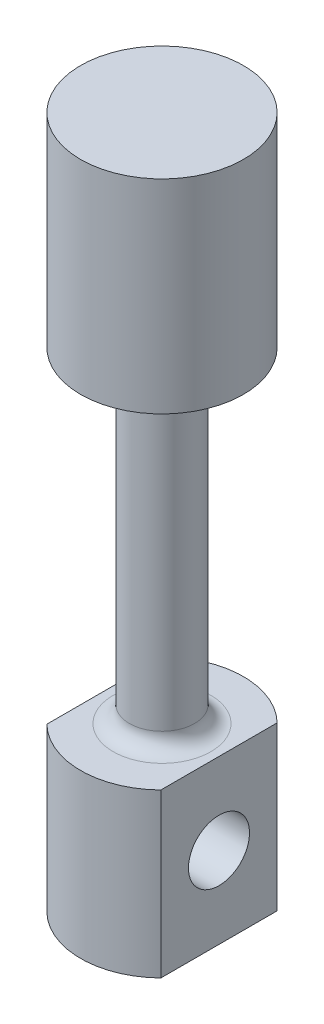
ISO-10303-21;
HEADER;
FILE_DESCRIPTION(('STEP AP214'),'2;1');
FILE_NAME('part.step','',(''),(''),'','','');
FILE_SCHEMA(('AUTOMOTIVE_DESIGN { 1 0 10303 214 1 1 1 1 }'));
ENDSEC;
DATA;
#1=APPLICATION_CONTEXT('core data for automotive mechanical design processes');
#2=APPLICATION_PROTOCOL_DEFINITION('international standard','automotive_design',2000,#1);
#3=PRODUCT_CONTEXT('',#1,'mechanical');
#4=PRODUCT('Part','Part','',(#3));
#5=PRODUCT_RELATED_PRODUCT_CATEGORY('part','',(#4));
#6=PRODUCT_DEFINITION_FORMATION('','',#4);
#7=PRODUCT_DEFINITION_CONTEXT('part definition',#1,'design');
#8=PRODUCT_DEFINITION('design','',#6,#7);
#9=PRODUCT_DEFINITION_SHAPE('','',#8);
#10=(LENGTH_UNIT() NAMED_UNIT(*) SI_UNIT(.MILLI.,.METRE.));
#11=(NAMED_UNIT(*) PLANE_ANGLE_UNIT() SI_UNIT($,.RADIAN.));
#12=(NAMED_UNIT(*) SI_UNIT($,.STERADIAN.) SOLID_ANGLE_UNIT());
#13=UNCERTAINTY_MEASURE_WITH_UNIT(LENGTH_MEASURE(1.E-05),#10,'distance_accuracy_value','');
#14=(GEOMETRIC_REPRESENTATION_CONTEXT(3) GLOBAL_UNCERTAINTY_ASSIGNED_CONTEXT((#13)) GLOBAL_UNIT_ASSIGNED_CONTEXT((#10,
#11,#12)) REPRESENTATION_CONTEXT('',''));
#15=CARTESIAN_POINT('',(0.,0.,0.));
#16=DIRECTION('',(0.,0.,1.));
#17=DIRECTION('',(1.,0.,0.));
#18=AXIS2_PLACEMENT_3D('',#15,#16,#17);
#19=CARTESIAN_POINT('',(26.0571246116683,12.7,0.));
#20=DIRECTION('',(0.,-1.,0.));
#21=DIRECTION('',(0.,0.,-1.));
#22=AXIS2_PLACEMENT_3D('',#19,#20,#21);
#23=PLANE('',#22);
#24=CARTESIAN_POINT('',(0.,12.7,0.));
#25=DIRECTION('',(0.,-1.,0.));
#26=DIRECTION('',(0.,0.,-1.));
#27=AXIS2_PLACEMENT_3D('',#24,#25,#26);
#28=CIRCLE('',#27,3.81);
#29=CARTESIAN_POINT('',(0.,12.7,-3.81));
#30=VERTEX_POINT('',#29);
#31=EDGE_CURVE('E111',#30,#30,#28,.T.);
#32=ORIENTED_EDGE('',*,*,#31,.T.);
#33=EDGE_LOOP('',(#32));
#34=FACE_BOUND('',#33,.T.);
#35=DIRECTION('',(0.,0.,-1.));
#36=VECTOR('',#35,1.);
#37=CARTESIAN_POINT('',(-4.445,12.7,0.));
#38=LINE('',#37,#36);
#39=CARTESIAN_POINT('',(-4.44499999999999,12.7,4.53480705212471));
#40=VERTEX_POINT('',#39);
#41=CARTESIAN_POINT('',(-4.445,12.7,-4.5348070521247));
#42=VERTEX_POINT('',#41);
#43=EDGE_CURVE('E74',#40,#42,#38,.T.);
#44=ORIENTED_EDGE('',*,*,#43,.F.);
#45=CARTESIAN_POINT('',(0.,12.7,0.));
#46=DIRECTION('',(0.,-1.,0.));
#47=DIRECTION('',(0.,0.,-1.));
#48=AXIS2_PLACEMENT_3D('',#45,#46,#47);
#49=CIRCLE('',#48,6.34999999999999);
#50=CARTESIAN_POINT('',(4.44499999999999,12.7,4.53480705212471));
#51=VERTEX_POINT('',#50);
#52=EDGE_CURVE('E83',#51,#40,#49,.T.);
#53=ORIENTED_EDGE('',*,*,#52,.F.);
#54=DIRECTION('',(0.,0.,-1.));
#55=VECTOR('',#54,1.);
#56=CARTESIAN_POINT('',(4.445,12.7,0.));
#57=LINE('',#56,#55);
#58=CARTESIAN_POINT('',(4.445,12.7,-4.5348070521247));
#59=VERTEX_POINT('',#58);
#60=EDGE_CURVE('E55',#51,#59,#57,.T.);
#61=ORIENTED_EDGE('',*,*,#60,.T.);
#62=EDGE_CURVE('E84',#42,#59,#49,.T.);
#63=ORIENTED_EDGE('',*,*,#62,.F.);
#64=EDGE_LOOP('',(#44,#53,#61,#63));
#65=FACE_BOUND('',#64,.T.);
#66=ADVANCED_FACE('F33',(#34,#65),#23,.F.);
#67=CARTESIAN_POINT('',(0.,0.,0.));
#68=DIRECTION('',(0.,1.,0.));
#69=DIRECTION('',(0.,0.,1.));
#70=AXIS2_PLACEMENT_3D('',#67,#68,#69);
#71=PLANE('',#70);
#72=DIRECTION('',(0.,0.,1.));
#73=VECTOR('',#72,1.);
#74=CARTESIAN_POINT('',(-4.445,0.,0.));
#75=LINE('',#74,#73);
#76=CARTESIAN_POINT('',(-4.445,0.,-4.5348070521247));
#77=VERTEX_POINT('',#76);
#78=CARTESIAN_POINT('',(-4.44499999999999,0.,4.53480705212471));
#79=VERTEX_POINT('',#78);
#80=EDGE_CURVE('E47',#77,#79,#75,.T.);
#81=ORIENTED_EDGE('',*,*,#80,.F.);
#82=CARTESIAN_POINT('',(0.,0.,0.));
#83=DIRECTION('',(0.,1.,0.));
#84=DIRECTION('',(0.,0.,1.));
#85=AXIS2_PLACEMENT_3D('',#82,#83,#84);
#86=CIRCLE('',#85,6.34999999999999);
#87=CARTESIAN_POINT('',(4.445,0.,-4.5348070521247));
#88=VERTEX_POINT('',#87);
#89=EDGE_CURVE('E96',#88,#77,#86,.T.);
#90=ORIENTED_EDGE('',*,*,#89,.F.);
#91=DIRECTION('',(0.,0.,1.));
#92=VECTOR('',#91,1.);
#93=CARTESIAN_POINT('',(4.445,0.,0.));
#94=LINE('',#93,#92);
#95=CARTESIAN_POINT('',(4.44499999999999,0.,4.53480705212471));
#96=VERTEX_POINT('',#95);
#97=EDGE_CURVE('E85',#88,#96,#94,.T.);
#98=ORIENTED_EDGE('',*,*,#97,.T.);
#99=EDGE_CURVE('E92',#79,#96,#86,.T.);
#100=ORIENTED_EDGE('',*,*,#99,.F.);
#101=EDGE_LOOP('',(#81,#90,#98,#100));
#102=FACE_BOUND('',#101,.T.);
#103=ADVANCED_FACE('F107',(#102),#71,.F.);
#104=CARTESIAN_POINT('',(0.,53.975,0.));
#105=DIRECTION('',(0.,-1.,0.));
#106=DIRECTION('',(0.,0.,-1.));
#107=AXIS2_PLACEMENT_3D('',#104,#105,#106);
#108=CYLINDRICAL_SURFACE('',#107,6.34999999999999);
#109=DIRECTION('',(0.,-1.,0.));
#110=VECTOR('',#109,1.);
#111=CARTESIAN_POINT('',(-4.44499999999999,53.975,-4.53480705212471));
#112=LINE('',#111,#110);
#113=EDGE_CURVE('E11',#42,#77,#112,.T.);
#114=ORIENTED_EDGE('',*,*,#113,.F.);
#115=ORIENTED_EDGE('',*,*,#62,.T.);
#116=DIRECTION('',(0.,-1.,0.));
#117=VECTOR('',#116,1.);
#118=CARTESIAN_POINT('',(4.44499999999999,53.975,-4.53480705212471));
#119=LINE('',#118,#117);
#120=EDGE_CURVE('E79',#59,#88,#119,.T.);
#121=ORIENTED_EDGE('',*,*,#120,.T.);
#122=ORIENTED_EDGE('',*,*,#89,.T.);
#123=EDGE_LOOP('',(#114,#115,#121,#122));
#124=FACE_BOUND('',#123,.T.);
#125=ADVANCED_FACE('F35',(#124),#108,.T.);
#126=DIRECTION('',(0.,-1.,0.));
#127=VECTOR('',#126,1.);
#128=CARTESIAN_POINT('',(-4.44499999999999,53.975,4.53480705212471));
#129=LINE('',#128,#127);
#130=EDGE_CURVE('E41',#79,#40,#129,.F.);
#131=ORIENTED_EDGE('',*,*,#130,.F.);
#132=ORIENTED_EDGE('',*,*,#99,.T.);
#133=DIRECTION('',(0.,-1.,0.));
#134=VECTOR('',#133,1.);
#135=CARTESIAN_POINT('',(4.44499999999999,53.975,4.53480705212471));
#136=LINE('',#135,#134);
#137=EDGE_CURVE('E88',#96,#51,#136,.F.);
#138=ORIENTED_EDGE('',*,*,#137,.T.);
#139=ORIENTED_EDGE('',*,*,#52,.T.);
#140=EDGE_LOOP('',(#131,#132,#138,#139));
#141=FACE_BOUND('',#140,.T.);
#142=ADVANCED_FACE('F87',(#141),#108,.T.);
#143=CARTESIAN_POINT('',(0.,38.1,0.));
#144=DIRECTION('',(0.,1.,0.));
#145=DIRECTION('',(0.,0.,1.));
#146=AXIS2_PLACEMENT_3D('',#143,#144,#145);
#147=CIRCLE('',#146,6.34999999999999);
#148=CARTESIAN_POINT('',(0.,38.1,6.34999999999999));
#149=VERTEX_POINT('',#148);
#150=EDGE_CURVE('E89',#149,#149,#147,.T.);
#151=ORIENTED_EDGE('',*,*,#150,.T.);
#152=EDGE_LOOP('',(#151));
#153=FACE_BOUND('',#152,.T.);
#154=CARTESIAN_POINT('',(0.,53.975,0.));
#155=DIRECTION('',(0.,1.,0.));
#156=DIRECTION('',(0.,0.,1.));
#157=AXIS2_PLACEMENT_3D('',#154,#155,#156);
#158=CIRCLE('',#157,6.34999999999999);
#159=CARTESIAN_POINT('',(0.,53.975,6.34999999999999));
#160=VERTEX_POINT('',#159);
#161=EDGE_CURVE('E100',#160,#160,#158,.T.);
#162=ORIENTED_EDGE('',*,*,#161,.F.);
#163=EDGE_LOOP('',(#162));
#164=FACE_BOUND('',#163,.T.);
#165=ADVANCED_FACE('F135',(#153,#164),#108,.T.);
#166=CARTESIAN_POINT('',(0.,53.975,0.));
#167=DIRECTION('',(0.,1.,0.));
#168=DIRECTION('',(0.,0.,1.));
#169=AXIS2_PLACEMENT_3D('',#166,#167,#168);
#170=PLANE('',#169);
#171=ORIENTED_EDGE('',*,*,#161,.T.);
#172=EDGE_LOOP('',(#171));
#173=FACE_BOUND('',#172,.T.);
#174=ADVANCED_FACE('F131',(#173),#170,.T.);
#175=CARTESIAN_POINT('',(26.0571246116683,38.1,0.));
#176=DIRECTION('',(0.,1.,0.));
#177=DIRECTION('',(0.,0.,1.));
#178=AXIS2_PLACEMENT_3D('',#175,#176,#177);
#179=PLANE('',#178);
#180=CARTESIAN_POINT('',(0.,38.1,0.));
#181=DIRECTION('',(0.,-1.,0.));
#182=DIRECTION('',(0.,0.,-1.));
#183=AXIS2_PLACEMENT_3D('',#180,#181,#182);
#184=CIRCLE('',#183,3.80999999999999);
#185=CARTESIAN_POINT('',(0.,38.1,-3.80999999999999));
#186=VERTEX_POINT('',#185);
#187=EDGE_CURVE('E94',#186,#186,#184,.T.);
#188=ORIENTED_EDGE('',*,*,#187,.F.);
#189=EDGE_LOOP('',(#188));
#190=FACE_BOUND('',#189,.T.);
#191=ORIENTED_EDGE('',*,*,#150,.F.);
#192=EDGE_LOOP('',(#191));
#193=FACE_BOUND('',#192,.T.);
#194=ADVANCED_FACE('F128',(#190,#193),#179,.F.);
#195=CARTESIAN_POINT('',(0.,36.83,0.));
#196=DIRECTION('',(0.,-1.,0.));
#197=DIRECTION('',(0.,0.,-1.));
#198=AXIS2_PLACEMENT_3D('',#195,#196,#197);
#199=TOROIDAL_SURFACE('',#198,3.80999999999999,1.27);
#200=CARTESIAN_POINT('',(0.,36.83,0.));
#201=DIRECTION('',(0.,-1.,0.));
#202=DIRECTION('',(0.,0.,-1.));
#203=AXIS2_PLACEMENT_3D('',#200,#201,#202);
#204=CIRCLE('',#203,2.53999999999999);
#205=CARTESIAN_POINT('',(0.,36.83,-2.53999999999999));
#206=VERTEX_POINT('',#205);
#207=EDGE_CURVE('E120',#206,#206,#204,.T.);
#208=ORIENTED_EDGE('',*,*,#207,.F.);
#209=EDGE_LOOP('',(#208));
#210=FACE_BOUND('',#209,.T.);
#211=ORIENTED_EDGE('',*,*,#187,.T.);
#212=EDGE_LOOP('',(#211));
#213=FACE_BOUND('',#212,.T.);
#214=ADVANCED_FACE('F126',(#210,#213),#199,.F.);
#215=CARTESIAN_POINT('',(0.,0.,0.));
#216=DIRECTION('',(0.,-1.,0.));
#217=DIRECTION('',(0.,0.,-1.));
#218=AXIS2_PLACEMENT_3D('',#215,#216,#217);
#219=CYLINDRICAL_SURFACE('',#218,2.53999999999999);
#220=CARTESIAN_POINT('',(0.,13.97,0.));
#221=DIRECTION('',(0.,-1.,0.));
#222=DIRECTION('',(0.,0.,-1.));
#223=AXIS2_PLACEMENT_3D('',#220,#221,#222);
#224=CIRCLE('',#223,2.54);
#225=CARTESIAN_POINT('',(0.,13.97,-2.54));
#226=VERTEX_POINT('',#225);
#227=EDGE_CURVE('E117',#226,#226,#224,.T.);
#228=ORIENTED_EDGE('',*,*,#227,.F.);
#229=EDGE_LOOP('',(#228));
#230=FACE_BOUND('',#229,.T.);
#231=ORIENTED_EDGE('',*,*,#207,.T.);
#232=EDGE_LOOP('',(#231));
#233=FACE_BOUND('',#232,.T.);
#234=ADVANCED_FACE('F156',(#230,#233),#219,.T.);
#235=CARTESIAN_POINT('',(0.,13.97,0.));
#236=DIRECTION('',(0.,-1.,0.));
#237=DIRECTION('',(0.,0.,-1.));
#238=AXIS2_PLACEMENT_3D('',#235,#236,#237);
#239=TOROIDAL_SURFACE('',#238,3.81,1.27);
#240=ORIENTED_EDGE('',*,*,#31,.F.);
#241=EDGE_LOOP('',(#240));
#242=FACE_BOUND('',#241,.T.);
#243=ORIENTED_EDGE('',*,*,#227,.T.);
#244=EDGE_LOOP('',(#243));
#245=FACE_BOUND('',#244,.T.);
#246=ADVANCED_FACE('F153',(#242,#245),#239,.F.);
#247=CARTESIAN_POINT('',(4.445,19.3564784473097,-6.34999999999999));
#248=DIRECTION('',(-1.,0.,0.));
#249=DIRECTION('',(0.,-1.,0.));
#250=AXIS2_PLACEMENT_3D('',#247,#248,#249);
#251=PLANE('',#250);
#252=CARTESIAN_POINT('',(4.445,6.34999999999995,0.));
#253=DIRECTION('',(-1.,0.,0.));
#254=DIRECTION('',(0.,-1.,0.));
#255=AXIS2_PLACEMENT_3D('',#252,#253,#254);
#256=CIRCLE('',#255,2.38124999999999);
#257=CARTESIAN_POINT('',(4.445,3.96874999999996,0.));
#258=VERTEX_POINT('',#257);
#259=EDGE_CURVE('E255',#258,#258,#256,.T.);
#260=ORIENTED_EDGE('',*,*,#259,.T.);
#261=EDGE_LOOP('',(#260));
#262=FACE_BOUND('',#261,.T.);
#263=ORIENTED_EDGE('',*,*,#60,.F.);
#264=ORIENTED_EDGE('',*,*,#137,.F.);
#265=ORIENTED_EDGE('',*,*,#97,.F.);
#266=ORIENTED_EDGE('',*,*,#120,.F.);
#267=EDGE_LOOP('',(#263,#264,#265,#266));
#268=FACE_BOUND('',#267,.T.);
#269=ADVANCED_FACE('F109',(#262,#268),#251,.F.);
#270=CARTESIAN_POINT('',(-4.445,19.3564784473097,-6.34999999999999));
#271=DIRECTION('',(-1.,0.,0.));
#272=DIRECTION('',(0.,-1.,0.));
#273=AXIS2_PLACEMENT_3D('',#270,#271,#272);
#274=PLANE('',#273);
#275=CARTESIAN_POINT('',(-4.445,6.34999999999995,0.));
#276=DIRECTION('',(-1.,0.,0.));
#277=DIRECTION('',(0.,0.,1.));
#278=AXIS2_PLACEMENT_3D('',#275,#276,#277);
#279=CIRCLE('',#278,2.38124999999999);
#280=CARTESIAN_POINT('',(-4.445,6.34999999999995,2.38124999999999));
#281=VERTEX_POINT('',#280);
#282=EDGE_CURVE('E252',#281,#281,#279,.T.);
#283=ORIENTED_EDGE('',*,*,#282,.F.);
#284=EDGE_LOOP('',(#283));
#285=FACE_BOUND('',#284,.T.);
#286=ORIENTED_EDGE('',*,*,#113,.T.);
#287=ORIENTED_EDGE('',*,*,#80,.T.);
#288=ORIENTED_EDGE('',*,*,#130,.T.);
#289=ORIENTED_EDGE('',*,*,#43,.T.);
#290=EDGE_LOOP('',(#286,#287,#288,#289));
#291=FACE_BOUND('',#290,.T.);
#292=ADVANCED_FACE('F73',(#285,#291),#274,.T.);
#293=CARTESIAN_POINT('',(-4.445,6.34999999999995,0.));
#294=DIRECTION('',(-1.,0.,0.));
#295=DIRECTION('',(0.,0.,1.));
#296=AXIS2_PLACEMENT_3D('',#293,#294,#295);
#297=CYLINDRICAL_SURFACE('',#296,2.38124999999999);
#298=ORIENTED_EDGE('',*,*,#282,.T.);
#299=EDGE_LOOP('',(#298));
#300=FACE_BOUND('',#299,.T.);
#301=ORIENTED_EDGE('',*,*,#259,.F.);
#302=EDGE_LOOP('',(#301));
#303=FACE_BOUND('',#302,.T.);
#304=ADVANCED_FACE('F190',(#300,#303),#297,.F.);
#305=CLOSED_SHELL('',(#66,#103,#125,#142,#165,#174,#194,#214,#234,#246,#269,#292,#304));
#306=MANIFOLD_SOLID_BREP('B2',#305);
#307=ADVANCED_BREP_SHAPE_REPRESENTATION('',(#18,#306),#14);
#308=SHAPE_DEFINITION_REPRESENTATION(#9,#307);
ENDSEC;
END-ISO-10303-21;
